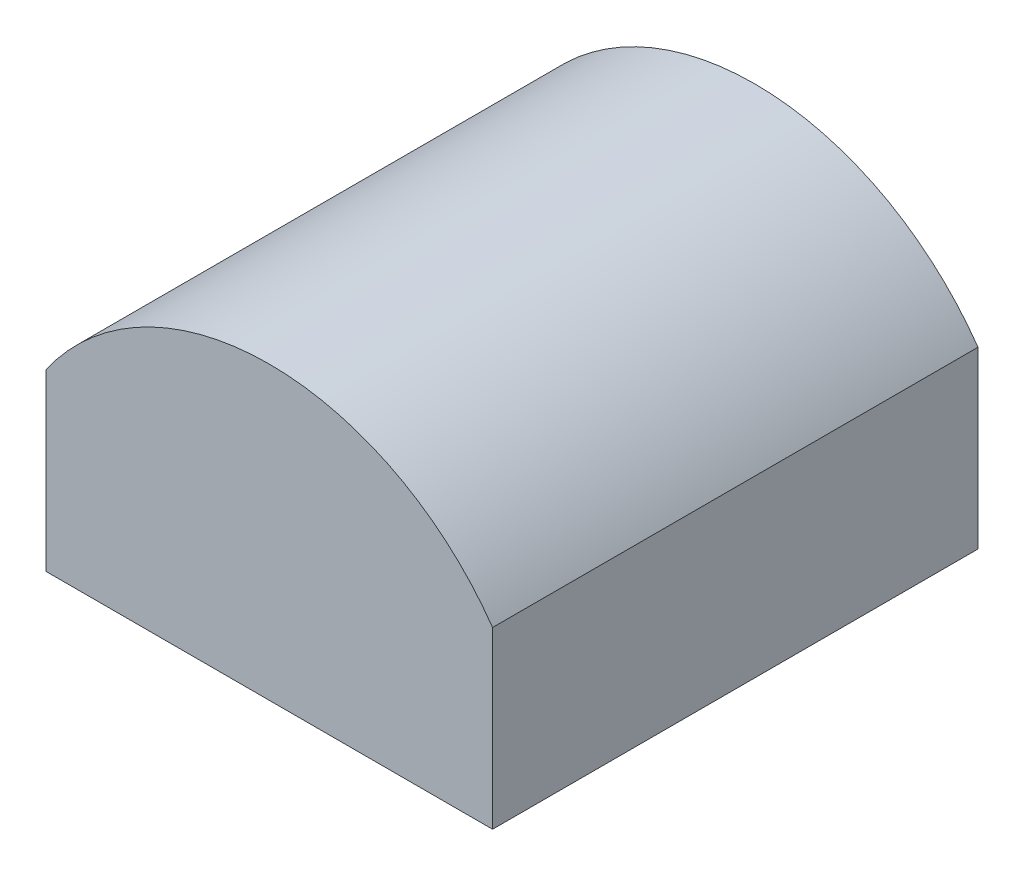
ISO-10303-21;
HEADER;
FILE_DESCRIPTION(('STEP AP214'),'2;1');
FILE_NAME('part.step','',(''),(''),'','','');
FILE_SCHEMA(('AUTOMOTIVE_DESIGN { 1 0 10303 214 1 1 1 1 }'));
ENDSEC;
DATA;
#1=APPLICATION_CONTEXT('core data for automotive mechanical design processes');
#2=APPLICATION_PROTOCOL_DEFINITION('international standard','automotive_design',2000,#1);
#3=PRODUCT_CONTEXT('',#1,'mechanical');
#4=PRODUCT('Part','Part','',(#3));
#5=PRODUCT_RELATED_PRODUCT_CATEGORY('part','',(#4));
#6=PRODUCT_DEFINITION_FORMATION('','',#4);
#7=PRODUCT_DEFINITION_CONTEXT('part definition',#1,'design');
#8=PRODUCT_DEFINITION('design','',#6,#7);
#9=PRODUCT_DEFINITION_SHAPE('','',#8);
#10=(LENGTH_UNIT() NAMED_UNIT(*) SI_UNIT(.MILLI.,.METRE.));
#11=(NAMED_UNIT(*) PLANE_ANGLE_UNIT() SI_UNIT($,.RADIAN.));
#12=(NAMED_UNIT(*) SI_UNIT($,.STERADIAN.) SOLID_ANGLE_UNIT());
#13=UNCERTAINTY_MEASURE_WITH_UNIT(LENGTH_MEASURE(1.E-05),#10,'distance_accuracy_value','');
#14=(GEOMETRIC_REPRESENTATION_CONTEXT(3) GLOBAL_UNCERTAINTY_ASSIGNED_CONTEXT((#13)) GLOBAL_UNIT_ASSIGNED_CONTEXT((#10,
#11,#12)) REPRESENTATION_CONTEXT('',''));
#15=CARTESIAN_POINT('',(0.,0.,0.));
#16=DIRECTION('',(0.,0.,1.));
#17=DIRECTION('',(1.,0.,0.));
#18=AXIS2_PLACEMENT_3D('',#15,#16,#17);
#19=CARTESIAN_POINT('',(0.318131791097093,-7.40333333333334,5.));
#20=DIRECTION('',(0.,0.,-1.));
#21=DIRECTION('',(-1.,0.,0.));
#22=AXIS2_PLACEMENT_3D('',#19,#20,#21);
#23=PLANE('',#22);
#24=CARTESIAN_POINT('',(0.318131791097097,-4.88250000000001,5.));
#25=DIRECTION('',(0.,0.,1.));
#26=DIRECTION('',(-1.,0.,0.));
#27=AXIS2_PLACEMENT_3D('',#24,#25,#26);
#28=CIRCLE('',#27,14.0208333333333);
#29=CARTESIAN_POINT('',(11.8181317910971,3.13833333333334,5.));
#30=VERTEX_POINT('',#29);
#31=CARTESIAN_POINT('',(-11.1818682089029,3.13833333333333,5.));
#32=VERTEX_POINT('',#31);
#33=EDGE_CURVE('E104',#30,#32,#28,.T.);
#34=ORIENTED_EDGE('',*,*,#33,.T.);
#35=DIRECTION('',(0.,-1.,0.));
#36=VECTOR('',#35,1.);
#37=CARTESIAN_POINT('',(-11.1818682089029,3.13833333333333,5.));
#38=LINE('',#37,#36);
#39=CARTESIAN_POINT('',(-11.1818682089029,-5.86166666666667,5.));
#40=VERTEX_POINT('',#39);
#41=EDGE_CURVE('E141',#32,#40,#38,.T.);
#42=ORIENTED_EDGE('',*,*,#41,.T.);
#43=DIRECTION('',(1.,0.,0.));
#44=VECTOR('',#43,1.);
#45=CARTESIAN_POINT('',(-11.1818682089029,-5.86166666666667,5.));
#46=LINE('',#45,#44);
#47=CARTESIAN_POINT('',(11.8181317910971,-5.86166666666667,5.));
#48=VERTEX_POINT('',#47);
#49=EDGE_CURVE('E143',#40,#48,#46,.T.);
#50=ORIENTED_EDGE('',*,*,#49,.T.);
#51=DIRECTION('',(0.,1.,0.));
#52=VECTOR('',#51,1.);
#53=CARTESIAN_POINT('',(11.8181317910971,-5.86166666666667,5.));
#54=LINE('',#53,#52);
#55=EDGE_CURVE('E145',#48,#30,#54,.T.);
#56=ORIENTED_EDGE('',*,*,#55,.T.);
#57=EDGE_LOOP('',(#34,#42,#50,#56));
#58=FACE_BOUND('',#57,.T.);
#59=ADVANCED_FACE('F33',(#58),#23,.F.);
#60=CARTESIAN_POINT('',(0.318131791097097,-4.88250000000001,5.));
#61=DIRECTION('',(0.,0.,-1.));
#62=DIRECTION('',(-1.,0.,0.));
#63=AXIS2_PLACEMENT_3D('',#60,#61,#62);
#64=CYLINDRICAL_SURFACE('',#63,14.0208333333333);
#65=DIRECTION('',(0.,0.,-1.));
#66=VECTOR('',#65,1.);
#67=CARTESIAN_POINT('',(11.8181317910971,3.13833333333334,5.));
#68=LINE('',#67,#66);
#69=CARTESIAN_POINT('',(11.8181317910971,3.13833333333334,-20.));
#70=VERTEX_POINT('',#69);
#71=EDGE_CURVE('E147',#30,#70,#68,.T.);
#72=ORIENTED_EDGE('',*,*,#71,.T.);
#73=CARTESIAN_POINT('',(0.318131791097097,-4.88250000000001,-20.));
#74=DIRECTION('',(0.,0.,1.));
#75=DIRECTION('',(-1.,0.,0.));
#76=AXIS2_PLACEMENT_3D('',#73,#74,#75);
#77=CIRCLE('',#76,14.0208333333333);
#78=CARTESIAN_POINT('',(-11.1818682089029,3.13833333333333,-20.));
#79=VERTEX_POINT('',#78);
#80=EDGE_CURVE('E123',#70,#79,#77,.T.);
#81=ORIENTED_EDGE('',*,*,#80,.T.);
#82=DIRECTION('',(0.,0.,-1.));
#83=VECTOR('',#82,1.);
#84=CARTESIAN_POINT('',(-11.1818682089029,3.13833333333333,5.));
#85=LINE('',#84,#83);
#86=EDGE_CURVE('E153',#32,#79,#85,.T.);
#87=ORIENTED_EDGE('',*,*,#86,.F.);
#88=ORIENTED_EDGE('',*,*,#33,.F.);
#89=EDGE_LOOP('',(#72,#81,#87,#88));
#90=FACE_BOUND('',#89,.T.);
#91=ADVANCED_FACE('F172',(#90),#64,.T.);
#92=CARTESIAN_POINT('',(-11.1818682089029,3.13833333333333,5.));
#93=DIRECTION('',(1.,0.,0.));
#94=DIRECTION('',(0.,1.,0.));
#95=AXIS2_PLACEMENT_3D('',#92,#93,#94);
#96=PLANE('',#95);
#97=ORIENTED_EDGE('',*,*,#86,.T.);
#98=DIRECTION('',(0.,-1.,0.));
#99=VECTOR('',#98,1.);
#100=CARTESIAN_POINT('',(-11.1818682089029,3.13833333333333,-20.));
#101=LINE('',#100,#99);
#102=CARTESIAN_POINT('',(-11.1818682089029,-5.86166666666667,-20.));
#103=VERTEX_POINT('',#102);
#104=EDGE_CURVE('E126',#79,#103,#101,.T.);
#105=ORIENTED_EDGE('',*,*,#104,.T.);
#106=DIRECTION('',(0.,0.,-1.));
#107=VECTOR('',#106,1.);
#108=CARTESIAN_POINT('',(-11.1818682089029,-5.86166666666667,5.));
#109=LINE('',#108,#107);
#110=EDGE_CURVE('E151',#40,#103,#109,.T.);
#111=ORIENTED_EDGE('',*,*,#110,.F.);
#112=ORIENTED_EDGE('',*,*,#41,.F.);
#113=EDGE_LOOP('',(#97,#105,#111,#112));
#114=FACE_BOUND('',#113,.T.);
#115=ADVANCED_FACE('F177',(#114),#96,.F.);
#116=CARTESIAN_POINT('',(-11.1818682089029,-5.86166666666667,5.));
#117=DIRECTION('',(0.,1.,0.));
#118=DIRECTION('',(0.,0.,1.));
#119=AXIS2_PLACEMENT_3D('',#116,#117,#118);
#120=PLANE('',#119);
#121=ORIENTED_EDGE('',*,*,#110,.T.);
#122=DIRECTION('',(1.,0.,0.));
#123=VECTOR('',#122,1.);
#124=CARTESIAN_POINT('',(-11.1818682089029,-5.86166666666667,-20.));
#125=LINE('',#124,#123);
#126=CARTESIAN_POINT('',(11.8181317910971,-5.86166666666667,-20.));
#127=VERTEX_POINT('',#126);
#128=EDGE_CURVE('E129',#103,#127,#125,.T.);
#129=ORIENTED_EDGE('',*,*,#128,.T.);
#130=DIRECTION('',(0.,0.,-1.));
#131=VECTOR('',#130,1.);
#132=CARTESIAN_POINT('',(11.8181317910971,-5.86166666666667,5.));
#133=LINE('',#132,#131);
#134=EDGE_CURVE('E149',#48,#127,#133,.T.);
#135=ORIENTED_EDGE('',*,*,#134,.F.);
#136=ORIENTED_EDGE('',*,*,#49,.F.);
#137=EDGE_LOOP('',(#121,#129,#135,#136));
#138=FACE_BOUND('',#137,.T.);
#139=ADVANCED_FACE('F183',(#138),#120,.F.);
#140=CARTESIAN_POINT('',(11.8181317910971,-5.86166666666667,5.));
#141=DIRECTION('',(-1.,0.,0.));
#142=DIRECTION('',(0.,0.,1.));
#143=AXIS2_PLACEMENT_3D('',#140,#141,#142);
#144=PLANE('',#143);
#145=ORIENTED_EDGE('',*,*,#134,.T.);
#146=DIRECTION('',(0.,1.,0.));
#147=VECTOR('',#146,1.);
#148=CARTESIAN_POINT('',(11.8181317910971,-5.86166666666667,-20.));
#149=LINE('',#148,#147);
#150=EDGE_CURVE('E132',#127,#70,#149,.T.);
#151=ORIENTED_EDGE('',*,*,#150,.T.);
#152=ORIENTED_EDGE('',*,*,#71,.F.);
#153=ORIENTED_EDGE('',*,*,#55,.F.);
#154=EDGE_LOOP('',(#145,#151,#152,#153));
#155=FACE_BOUND('',#154,.T.);
#156=ADVANCED_FACE('F187',(#155),#144,.F.);
#157=CARTESIAN_POINT('',(0.318131791097093,-7.40333333333334,5.));
#158=DIRECTION('',(0.,0.,-1.));
#159=DIRECTION('',(-1.,0.,0.));
#160=AXIS2_PLACEMENT_3D('',#157,#158,#159);
#161=CYLINDRICAL_SURFACE('',#160,13.5416666666667);
#162=DIRECTION('',(0.,0.,-1.));
#163=VECTOR('',#162,1.);
#164=CARTESIAN_POINT('',(8.81813179109709,3.13833333333333,5.));
#165=LINE('',#164,#163);
#166=CARTESIAN_POINT('',(8.81813179109709,3.13833333333333,0.));
#167=VERTEX_POINT('',#166);
#168=CARTESIAN_POINT('',(8.81813179109709,3.13833333333333,-20.));
#169=VERTEX_POINT('',#168);
#170=EDGE_CURVE('E135',#167,#169,#165,.T.);
#171=ORIENTED_EDGE('',*,*,#170,.F.);
#172=CARTESIAN_POINT('',(0.318131791097093,-7.40333333333334,0.));
#173=DIRECTION('',(0.,0.,-1.));
#174=DIRECTION('',(-1.,0.,0.));
#175=AXIS2_PLACEMENT_3D('',#172,#173,#174);
#176=CIRCLE('',#175,13.5416666666667);
#177=CARTESIAN_POINT('',(-8.18186820890291,3.13833333333333,0.));
#178=VERTEX_POINT('',#177);
#179=EDGE_CURVE('E56',#178,#167,#176,.T.);
#180=ORIENTED_EDGE('',*,*,#179,.F.);
#181=DIRECTION('',(0.,0.,-1.));
#182=VECTOR('',#181,1.);
#183=CARTESIAN_POINT('',(-8.18186820890291,3.13833333333333,5.));
#184=LINE('',#183,#182);
#185=CARTESIAN_POINT('',(-8.18186820890291,3.13833333333333,-20.));
#186=VERTEX_POINT('',#185);
#187=EDGE_CURVE('E96',#178,#186,#184,.T.);
#188=ORIENTED_EDGE('',*,*,#187,.T.);
#189=CARTESIAN_POINT('',(0.318131791097093,-7.40333333333334,-20.));
#190=DIRECTION('',(0.,0.,1.));
#191=DIRECTION('',(-1.,0.,0.));
#192=AXIS2_PLACEMENT_3D('',#189,#190,#191);
#193=CIRCLE('',#192,13.5416666666667);
#194=EDGE_CURVE('E100',#169,#186,#193,.T.);
#195=ORIENTED_EDGE('',*,*,#194,.F.);
#196=EDGE_LOOP('',(#171,#180,#188,#195));
#197=FACE_BOUND('',#196,.T.);
#198=ADVANCED_FACE('F98',(#197),#161,.F.);
#199=CARTESIAN_POINT('',(-8.18186820890291,3.13833333333333,5.));
#200=DIRECTION('',(1.,0.,0.));
#201=DIRECTION('',(0.,0.,-1.));
#202=AXIS2_PLACEMENT_3D('',#199,#200,#201);
#203=PLANE('',#202);
#204=ORIENTED_EDGE('',*,*,#187,.F.);
#205=DIRECTION('',(0.,-1.,0.));
#206=VECTOR('',#205,1.);
#207=CARTESIAN_POINT('',(-8.18186820890291,3.13833333333333,0.));
#208=LINE('',#207,#206);
#209=CARTESIAN_POINT('',(-8.18186820890291,-2.86166666666667,0.));
#210=VERTEX_POINT('',#209);
#211=EDGE_CURVE('E11',#178,#210,#208,.T.);
#212=ORIENTED_EDGE('',*,*,#211,.T.);
#213=DIRECTION('',(0.,0.,-1.));
#214=VECTOR('',#213,1.);
#215=CARTESIAN_POINT('',(-8.18186820890291,-2.86166666666667,5.));
#216=LINE('',#215,#214);
#217=CARTESIAN_POINT('',(-8.18186820890291,-2.86166666666667,-20.));
#218=VERTEX_POINT('',#217);
#219=EDGE_CURVE('E105',#210,#218,#216,.T.);
#220=ORIENTED_EDGE('',*,*,#219,.T.);
#221=DIRECTION('',(0.,-1.,0.));
#222=VECTOR('',#221,1.);
#223=CARTESIAN_POINT('',(-8.18186820890291,3.13833333333333,-20.));
#224=LINE('',#223,#222);
#225=EDGE_CURVE('E108',#186,#218,#224,.T.);
#226=ORIENTED_EDGE('',*,*,#225,.F.);
#227=EDGE_LOOP('',(#204,#212,#220,#226));
#228=FACE_BOUND('',#227,.T.);
#229=ADVANCED_FACE('F109',(#228),#203,.T.);
#230=CARTESIAN_POINT('',(-8.18186820890291,-2.86166666666667,5.));
#231=DIRECTION('',(0.,1.,0.));
#232=DIRECTION('',(0.,0.,1.));
#233=AXIS2_PLACEMENT_3D('',#230,#231,#232);
#234=PLANE('',#233);
#235=ORIENTED_EDGE('',*,*,#219,.F.);
#236=DIRECTION('',(1.,0.,0.));
#237=VECTOR('',#236,1.);
#238=CARTESIAN_POINT('',(-8.18186820890291,-2.86166666666667,0.));
#239=LINE('',#238,#237);
#240=CARTESIAN_POINT('',(8.81813179109709,-2.86166666666667,0.));
#241=VERTEX_POINT('',#240);
#242=EDGE_CURVE('E41',#210,#241,#239,.T.);
#243=ORIENTED_EDGE('',*,*,#242,.T.);
#244=DIRECTION('',(0.,0.,-1.));
#245=VECTOR('',#244,1.);
#246=CARTESIAN_POINT('',(8.81813179109709,-2.86166666666667,5.));
#247=LINE('',#246,#245);
#248=CARTESIAN_POINT('',(8.81813179109709,-2.86166666666667,-20.));
#249=VERTEX_POINT('',#248);
#250=EDGE_CURVE('E48',#241,#249,#247,.T.);
#251=ORIENTED_EDGE('',*,*,#250,.T.);
#252=DIRECTION('',(1.,0.,0.));
#253=VECTOR('',#252,1.);
#254=CARTESIAN_POINT('',(-8.18186820890291,-2.86166666666667,-20.));
#255=LINE('',#254,#253);
#256=EDGE_CURVE('E114',#218,#249,#255,.T.);
#257=ORIENTED_EDGE('',*,*,#256,.F.);
#258=EDGE_LOOP('',(#235,#243,#251,#257));
#259=FACE_BOUND('',#258,.T.);
#260=ADVANCED_FACE('F160',(#259),#234,.T.);
#261=CARTESIAN_POINT('',(8.81813179109709,3.13833333333333,5.));
#262=DIRECTION('',(-1.,0.,0.));
#263=DIRECTION('',(0.,0.,1.));
#264=AXIS2_PLACEMENT_3D('',#261,#262,#263);
#265=PLANE('',#264);
#266=ORIENTED_EDGE('',*,*,#250,.F.);
#267=DIRECTION('',(0.,-1.,0.));
#268=VECTOR('',#267,1.);
#269=CARTESIAN_POINT('',(8.81813179109709,3.13833333333333,0.));
#270=LINE('',#269,#268);
#271=EDGE_CURVE('E156',#167,#241,#270,.T.);
#272=ORIENTED_EDGE('',*,*,#271,.F.);
#273=ORIENTED_EDGE('',*,*,#170,.T.);
#274=DIRECTION('',(0.,1.,0.));
#275=VECTOR('',#274,1.);
#276=CARTESIAN_POINT('',(8.81813179109709,3.13833333333333,-20.));
#277=LINE('',#276,#275);
#278=EDGE_CURVE('E118',#249,#169,#277,.T.);
#279=ORIENTED_EDGE('',*,*,#278,.F.);
#280=EDGE_LOOP('',(#266,#272,#273,#279));
#281=FACE_BOUND('',#280,.T.);
#282=ADVANCED_FACE('F162',(#281),#265,.T.);
#283=CARTESIAN_POINT('',(0.318131791097097,-4.88250000000001,-20.));
#284=DIRECTION('',(0.,0.,-1.));
#285=DIRECTION('',(-1.,0.,0.));
#286=AXIS2_PLACEMENT_3D('',#283,#284,#285);
#287=PLANE('',#286);
#288=ORIENTED_EDGE('',*,*,#194,.T.);
#289=ORIENTED_EDGE('',*,*,#225,.T.);
#290=ORIENTED_EDGE('',*,*,#256,.T.);
#291=ORIENTED_EDGE('',*,*,#278,.T.);
#292=EDGE_LOOP('',(#288,#289,#290,#291));
#293=FACE_BOUND('',#292,.T.);
#294=ORIENTED_EDGE('',*,*,#80,.F.);
#295=ORIENTED_EDGE('',*,*,#150,.F.);
#296=ORIENTED_EDGE('',*,*,#128,.F.);
#297=ORIENTED_EDGE('',*,*,#104,.F.);
#298=EDGE_LOOP('',(#294,#295,#296,#297));
#299=FACE_BOUND('',#298,.T.);
#300=ADVANCED_FACE('F116',(#293,#299),#287,.T.);
#301=CARTESIAN_POINT('',(0.318131791097093,-7.40333333333334,0.));
#302=DIRECTION('',(0.,0.,-1.));
#303=DIRECTION('',(-1.,0.,0.));
#304=AXIS2_PLACEMENT_3D('',#301,#302,#303);
#305=PLANE('',#304);
#306=ORIENTED_EDGE('',*,*,#179,.T.);
#307=ORIENTED_EDGE('',*,*,#271,.T.);
#308=ORIENTED_EDGE('',*,*,#242,.F.);
#309=ORIENTED_EDGE('',*,*,#211,.F.);
#310=EDGE_LOOP('',(#306,#307,#308,#309));
#311=FACE_BOUND('',#310,.T.);
#312=ADVANCED_FACE('F35',(#311),#305,.T.);
#313=CLOSED_SHELL('',(#59,#91,#115,#139,#156,#198,#229,#260,#282,#300,#312));
#314=MANIFOLD_SOLID_BREP('B2',#313);
#315=ADVANCED_BREP_SHAPE_REPRESENTATION('',(#18,#314),#14);
#316=SHAPE_DEFINITION_REPRESENTATION(#9,#315);
ENDSEC;
END-ISO-10303-21;
